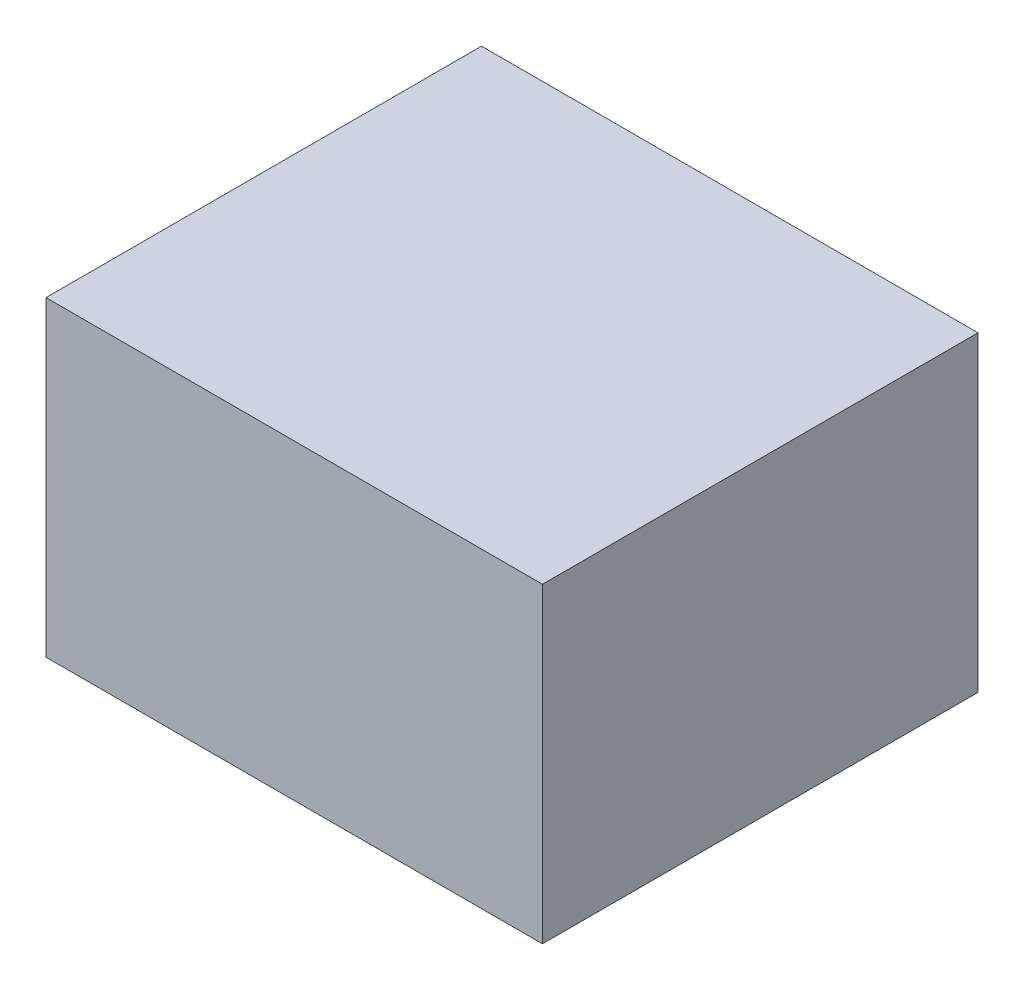
ISO-10303-21;
HEADER;
FILE_DESCRIPTION(('STEP AP214'),'2;1');
FILE_NAME('part.step','',(''),(''),'','','');
FILE_SCHEMA(('AUTOMOTIVE_DESIGN { 1 0 10303 214 1 1 1 1 }'));
ENDSEC;
DATA;
#1=APPLICATION_CONTEXT('core data for automotive mechanical design processes');
#2=APPLICATION_PROTOCOL_DEFINITION('international standard','automotive_design',2000,#1);
#3=PRODUCT_CONTEXT('',#1,'mechanical');
#4=PRODUCT('Part','Part','',(#3));
#5=PRODUCT_RELATED_PRODUCT_CATEGORY('part','',(#4));
#6=PRODUCT_DEFINITION_FORMATION('','',#4);
#7=PRODUCT_DEFINITION_CONTEXT('part definition',#1,'design');
#8=PRODUCT_DEFINITION('design','',#6,#7);
#9=PRODUCT_DEFINITION_SHAPE('','',#8);
#10=(LENGTH_UNIT() NAMED_UNIT(*) SI_UNIT(.MILLI.,.METRE.));
#11=(NAMED_UNIT(*) PLANE_ANGLE_UNIT() SI_UNIT($,.RADIAN.));
#12=(NAMED_UNIT(*) SI_UNIT($,.STERADIAN.) SOLID_ANGLE_UNIT());
#13=UNCERTAINTY_MEASURE_WITH_UNIT(LENGTH_MEASURE(1.E-05),#10,'distance_accuracy_value','');
#14=(GEOMETRIC_REPRESENTATION_CONTEXT(3) GLOBAL_UNCERTAINTY_ASSIGNED_CONTEXT((#13)) GLOBAL_UNIT_ASSIGNED_CONTEXT((#10,
#11,#12)) REPRESENTATION_CONTEXT('',''));
#15=CARTESIAN_POINT('',(0.,0.,0.));
#16=DIRECTION('',(0.,0.,1.));
#17=DIRECTION('',(1.,0.,0.));
#18=AXIS2_PLACEMENT_3D('',#15,#16,#17);
#19=CARTESIAN_POINT('',(-30.6643083900227,35.052,-15.9657142857143));
#20=DIRECTION('',(1.,0.,0.));
#21=DIRECTION('',(0.,0.,-1.));
#22=AXIS2_PLACEMENT_3D('',#19,#20,#21);
#23=PLANE('',#22);
#24=DIRECTION('',(0.,0.,1.));
#25=VECTOR('',#24,1.);
#26=CARTESIAN_POINT('',(-30.6643083900227,0.,-15.9657142857143));
#27=LINE('',#26,#25);
#28=CARTESIAN_POINT('',(-30.6643083900227,0.,-15.9657142857143));
#29=VERTEX_POINT('',#28);
#30=CARTESIAN_POINT('',(-30.6643083900227,0.,33.0562857142857));
#31=VERTEX_POINT('',#30);
#32=EDGE_CURVE('E104',#29,#31,#27,.T.);
#33=ORIENTED_EDGE('',*,*,#32,.T.);
#34=DIRECTION('',(0.,-1.,0.));
#35=VECTOR('',#34,1.);
#36=CARTESIAN_POINT('',(-30.6643083900227,35.052,33.0562857142857));
#37=LINE('',#36,#35);
#38=CARTESIAN_POINT('',(-30.6643083900227,35.052,33.0562857142857));
#39=VERTEX_POINT('',#38);
#40=EDGE_CURVE('E46',#39,#31,#37,.T.);
#41=ORIENTED_EDGE('',*,*,#40,.F.);
#42=DIRECTION('',(0.,0.,1.));
#43=VECTOR('',#42,1.);
#44=CARTESIAN_POINT('',(-30.6643083900227,35.052,-15.9657142857143));
#45=LINE('',#44,#43);
#46=CARTESIAN_POINT('',(-30.6643083900227,35.052,-15.9657142857143));
#47=VERTEX_POINT('',#46);
#48=EDGE_CURVE('E90',#47,#39,#45,.T.);
#49=ORIENTED_EDGE('',*,*,#48,.F.);
#50=DIRECTION('',(0.,-1.,0.));
#51=VECTOR('',#50,1.);
#52=CARTESIAN_POINT('',(-30.6643083900227,35.052,-15.9657142857143));
#53=LINE('',#52,#51);
#54=EDGE_CURVE('E100',#47,#29,#53,.T.);
#55=ORIENTED_EDGE('',*,*,#54,.T.);
#56=EDGE_LOOP('',(#33,#41,#49,#55));
#57=FACE_BOUND('',#56,.T.);
#58=ADVANCED_FACE('F38',(#57),#23,.F.);
#59=CARTESIAN_POINT('',(-30.6643083900227,35.052,33.0562857142857));
#60=DIRECTION('',(0.,0.,-1.));
#61=DIRECTION('',(-1.,0.,0.));
#62=AXIS2_PLACEMENT_3D('',#59,#60,#61);
#63=PLANE('',#62);
#64=DIRECTION('',(1.,0.,0.));
#65=VECTOR('',#64,1.);
#66=CARTESIAN_POINT('',(-30.6643083900227,0.,33.0562857142857));
#67=LINE('',#66,#65);
#68=CARTESIAN_POINT('',(25.2156916099773,0.,33.0562857142857));
#69=VERTEX_POINT('',#68);
#70=EDGE_CURVE('E95',#31,#69,#67,.T.);
#71=ORIENTED_EDGE('',*,*,#70,.T.);
#72=DIRECTION('',(0.,-1.,0.));
#73=VECTOR('',#72,1.);
#74=CARTESIAN_POINT('',(25.2156916099773,35.052,33.0562857142857));
#75=LINE('',#74,#73);
#76=CARTESIAN_POINT('',(25.2156916099773,35.052,33.0562857142857));
#77=VERTEX_POINT('',#76);
#78=EDGE_CURVE('E93',#77,#69,#75,.T.);
#79=ORIENTED_EDGE('',*,*,#78,.F.);
#80=DIRECTION('',(1.,0.,0.));
#81=VECTOR('',#80,1.);
#82=CARTESIAN_POINT('',(-30.6643083900227,35.052,33.0562857142857));
#83=LINE('',#82,#81);
#84=EDGE_CURVE('E85',#39,#77,#83,.T.);
#85=ORIENTED_EDGE('',*,*,#84,.F.);
#86=ORIENTED_EDGE('',*,*,#40,.T.);
#87=EDGE_LOOP('',(#71,#79,#85,#86));
#88=FACE_BOUND('',#87,.T.);
#89=ADVANCED_FACE('F94',(#88),#63,.F.);
#90=CARTESIAN_POINT('',(25.2156916099773,35.052,-15.9657142857143));
#91=DIRECTION('',(-1.,0.,0.));
#92=DIRECTION('',(0.,0.,1.));
#93=AXIS2_PLACEMENT_3D('',#90,#91,#92);
#94=PLANE('',#93);
#95=DIRECTION('',(0.,0.,-1.));
#96=VECTOR('',#95,1.);
#97=CARTESIAN_POINT('',(25.2156916099773,0.,-15.9657142857143));
#98=LINE('',#97,#96);
#99=CARTESIAN_POINT('',(25.2156916099773,0.,-15.9657142857143));
#100=VERTEX_POINT('',#99);
#101=EDGE_CURVE('E71',#69,#100,#98,.T.);
#102=ORIENTED_EDGE('',*,*,#101,.T.);
#103=DIRECTION('',(0.,-1.,0.));
#104=VECTOR('',#103,1.);
#105=CARTESIAN_POINT('',(25.2156916099773,35.052,-15.9657142857143));
#106=LINE('',#105,#104);
#107=CARTESIAN_POINT('',(25.2156916099773,35.052,-15.9657142857143));
#108=VERTEX_POINT('',#107);
#109=EDGE_CURVE('E96',#108,#100,#106,.T.);
#110=ORIENTED_EDGE('',*,*,#109,.F.);
#111=DIRECTION('',(0.,0.,-1.));
#112=VECTOR('',#111,1.);
#113=CARTESIAN_POINT('',(25.2156916099773,35.052,-15.9657142857143));
#114=LINE('',#113,#112);
#115=EDGE_CURVE('E88',#77,#108,#114,.T.);
#116=ORIENTED_EDGE('',*,*,#115,.F.);
#117=ORIENTED_EDGE('',*,*,#78,.T.);
#118=EDGE_LOOP('',(#102,#110,#116,#117));
#119=FACE_BOUND('',#118,.T.);
#120=ADVANCED_FACE('F98',(#119),#94,.F.);
#121=CARTESIAN_POINT('',(-30.6643083900227,35.052,-15.9657142857143));
#122=DIRECTION('',(0.,0.,1.));
#123=DIRECTION('',(1.,0.,0.));
#124=AXIS2_PLACEMENT_3D('',#121,#122,#123);
#125=PLANE('',#124);
#126=CARTESIAN_POINT('',(15.0556916099773,17.526,-15.9657142857143));
#127=DIRECTION('',(0.,0.,1.));
#128=DIRECTION('',(1.,0.,0.));
#129=AXIS2_PLACEMENT_3D('',#126,#127,#128);
#130=CIRCLE('',#129,3.175);
#131=CARTESIAN_POINT('',(18.2306916099773,17.526,-15.9657142857143));
#132=VERTEX_POINT('',#131);
#133=EDGE_CURVE('E11',#132,#132,#130,.F.);
#134=ORIENTED_EDGE('',*,*,#133,.F.);
#135=EDGE_LOOP('',(#134));
#136=FACE_BOUND('',#135,.T.);
#137=DIRECTION('',(-1.,0.,0.));
#138=VECTOR('',#137,1.);
#139=CARTESIAN_POINT('',(-30.6643083900227,0.,-15.9657142857143));
#140=LINE('',#139,#138);
#141=EDGE_CURVE('E77',#100,#29,#140,.T.);
#142=ORIENTED_EDGE('',*,*,#141,.T.);
#143=ORIENTED_EDGE('',*,*,#54,.F.);
#144=DIRECTION('',(-1.,0.,0.));
#145=VECTOR('',#144,1.);
#146=CARTESIAN_POINT('',(-30.6643083900227,35.052,-15.9657142857143));
#147=LINE('',#146,#145);
#148=EDGE_CURVE('E54',#108,#47,#147,.T.);
#149=ORIENTED_EDGE('',*,*,#148,.F.);
#150=ORIENTED_EDGE('',*,*,#109,.T.);
#151=EDGE_LOOP('',(#142,#143,#149,#150));
#152=FACE_BOUND('',#151,.T.);
#153=ADVANCED_FACE('F126',(#136,#152),#125,.F.);
#154=CARTESIAN_POINT('',(0.,35.052,0.));
#155=DIRECTION('',(0.,1.,0.));
#156=DIRECTION('',(0.,0.,1.));
#157=AXIS2_PLACEMENT_3D('',#154,#155,#156);
#158=PLANE('',#157);
#159=ORIENTED_EDGE('',*,*,#48,.T.);
#160=ORIENTED_EDGE('',*,*,#84,.T.);
#161=ORIENTED_EDGE('',*,*,#115,.T.);
#162=ORIENTED_EDGE('',*,*,#148,.T.);
#163=EDGE_LOOP('',(#159,#160,#161,#162));
#164=FACE_BOUND('',#163,.T.);
#165=ADVANCED_FACE('F86',(#164),#158,.T.);
#166=CARTESIAN_POINT('',(0.,0.,0.));
#167=DIRECTION('',(0.,1.,0.));
#168=DIRECTION('',(0.,0.,1.));
#169=AXIS2_PLACEMENT_3D('',#166,#167,#168);
#170=PLANE('',#169);
#171=ORIENTED_EDGE('',*,*,#32,.F.);
#172=ORIENTED_EDGE('',*,*,#141,.F.);
#173=ORIENTED_EDGE('',*,*,#101,.F.);
#174=ORIENTED_EDGE('',*,*,#70,.F.);
#175=EDGE_LOOP('',(#171,#172,#173,#174));
#176=FACE_BOUND('',#175,.T.);
#177=ADVANCED_FACE('F115',(#176),#170,.F.);
#178=CARTESIAN_POINT('',(15.0556916099773,17.526,-21.0457142857143));
#179=DIRECTION('',(0.,0.,1.));
#180=DIRECTION('',(1.,0.,0.));
#181=AXIS2_PLACEMENT_3D('',#178,#179,#180);
#182=CYLINDRICAL_SURFACE('',#181,3.175);
#183=CARTESIAN_POINT('',(15.0556916099773,17.526,-21.0457142857143));
#184=DIRECTION('',(0.,0.,-1.));
#185=DIRECTION('',(-1.,0.,0.));
#186=AXIS2_PLACEMENT_3D('',#183,#184,#185);
#187=CIRCLE('',#186,3.175);
#188=CARTESIAN_POINT('',(11.8806916099773,17.526,-21.0457142857143));
#189=VERTEX_POINT('',#188);
#190=EDGE_CURVE('E107',#189,#189,#187,.T.);
#191=ORIENTED_EDGE('',*,*,#190,.F.);
#192=EDGE_LOOP('',(#191));
#193=FACE_BOUND('',#192,.T.);
#194=ORIENTED_EDGE('',*,*,#133,.T.);
#195=EDGE_LOOP('',(#194));
#196=FACE_BOUND('',#195,.T.);
#197=ADVANCED_FACE('F117',(#193,#196),#182,.T.);
#198=CARTESIAN_POINT('',(15.0556916099773,17.526,-21.0457142857143));
#199=DIRECTION('',(0.,0.,-1.));
#200=DIRECTION('',(-1.,0.,0.));
#201=AXIS2_PLACEMENT_3D('',#198,#199,#200);
#202=PLANE('',#201);
#203=ORIENTED_EDGE('',*,*,#190,.T.);
#204=EDGE_LOOP('',(#203));
#205=FACE_BOUND('',#204,.T.);
#206=ADVANCED_FACE('F123',(#205),#202,.T.);
#207=CLOSED_SHELL('',(#58,#89,#120,#153,#165,#177,#197,#206));
#208=MANIFOLD_SOLID_BREP('B2',#207);
#209=ADVANCED_BREP_SHAPE_REPRESENTATION('',(#18,#208),#14);
#210=SHAPE_DEFINITION_REPRESENTATION(#9,#209);
ENDSEC;
END-ISO-10303-21;
